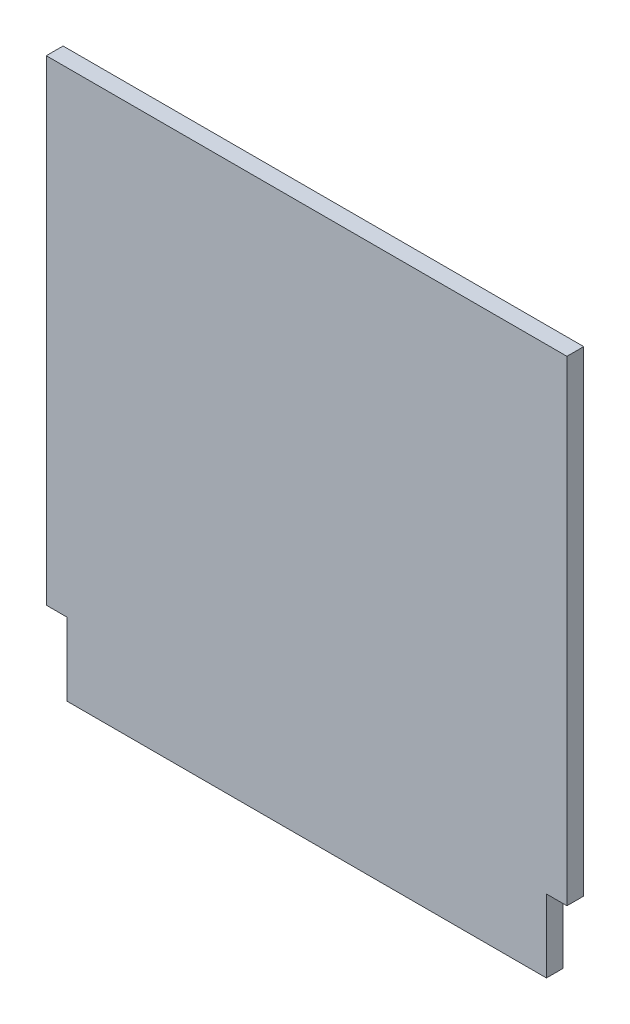
ISO-10303-21;
HEADER;
FILE_DESCRIPTION(('STEP AP214'),'2;1');
FILE_NAME('part.step','',(''),(''),'','','');
FILE_SCHEMA(('AUTOMOTIVE_DESIGN { 1 0 10303 214 1 1 1 1 }'));
ENDSEC;
DATA;
#1=APPLICATION_CONTEXT('core data for automotive mechanical design processes');
#2=APPLICATION_PROTOCOL_DEFINITION('international standard','automotive_design',2000,#1);
#3=PRODUCT_CONTEXT('',#1,'mechanical');
#4=PRODUCT('Part','Part','',(#3));
#5=PRODUCT_RELATED_PRODUCT_CATEGORY('part','',(#4));
#6=PRODUCT_DEFINITION_FORMATION('','',#4);
#7=PRODUCT_DEFINITION_CONTEXT('part definition',#1,'design');
#8=PRODUCT_DEFINITION('design','',#6,#7);
#9=PRODUCT_DEFINITION_SHAPE('','',#8);
#10=(LENGTH_UNIT() NAMED_UNIT(*) SI_UNIT(.MILLI.,.METRE.));
#11=(NAMED_UNIT(*) PLANE_ANGLE_UNIT() SI_UNIT($,.RADIAN.));
#12=(NAMED_UNIT(*) SI_UNIT($,.STERADIAN.) SOLID_ANGLE_UNIT());
#13=UNCERTAINTY_MEASURE_WITH_UNIT(LENGTH_MEASURE(1.E-05),#10,'distance_accuracy_value','');
#14=(GEOMETRIC_REPRESENTATION_CONTEXT(3) GLOBAL_UNCERTAINTY_ASSIGNED_CONTEXT((#13)) GLOBAL_UNIT_ASSIGNED_CONTEXT((#10,
#11,#12)) REPRESENTATION_CONTEXT('',''));
#15=CARTESIAN_POINT('',(0.,0.,0.));
#16=DIRECTION('',(0.,0.,1.));
#17=DIRECTION('',(1.,0.,0.));
#18=AXIS2_PLACEMENT_3D('',#15,#16,#17);
#19=CARTESIAN_POINT('',(46.5,49.,3.));
#20=DIRECTION('',(-1.,0.,0.));
#21=DIRECTION('',(0.,-1.,0.));
#22=AXIS2_PLACEMENT_3D('',#19,#20,#21);
#23=PLANE('',#22);
#24=DIRECTION('',(0.,1.,0.));
#25=VECTOR('',#24,1.);
#26=CARTESIAN_POINT('',(46.5,49.,3.));
#27=LINE('',#26,#25);
#28=CARTESIAN_POINT('',(46.5,-36.,3.));
#29=VERTEX_POINT('',#28);
#30=CARTESIAN_POINT('',(46.5,49.,3.));
#31=VERTEX_POINT('',#30);
#32=EDGE_CURVE('E156',#29,#31,#27,.T.);
#33=ORIENTED_EDGE('',*,*,#32,.F.);
#34=DIRECTION('',(0.,0.,1.));
#35=VECTOR('',#34,1.);
#36=CARTESIAN_POINT('',(46.5,-36.,0.));
#37=LINE('',#36,#35);
#38=CARTESIAN_POINT('',(46.5,-36.,0.));
#39=VERTEX_POINT('',#38);
#40=EDGE_CURVE('E198',#39,#29,#37,.T.);
#41=ORIENTED_EDGE('',*,*,#40,.F.);
#42=DIRECTION('',(0.,1.,0.));
#43=VECTOR('',#42,1.);
#44=CARTESIAN_POINT('',(46.5,49.,0.));
#45=LINE('',#44,#43);
#46=CARTESIAN_POINT('',(46.5,49.,0.));
#47=VERTEX_POINT('',#46);
#48=EDGE_CURVE('E175',#39,#47,#45,.T.);
#49=ORIENTED_EDGE('',*,*,#48,.T.);
#50=DIRECTION('',(0.,0.,-1.));
#51=VECTOR('',#50,1.);
#52=CARTESIAN_POINT('',(46.5,49.,3.));
#53=LINE('',#52,#51);
#54=EDGE_CURVE('E12',#31,#47,#53,.T.);
#55=ORIENTED_EDGE('',*,*,#54,.F.);
#56=EDGE_LOOP('',(#33,#41,#49,#55));
#57=FACE_BOUND('',#56,.T.);
#58=ADVANCED_FACE('F48',(#57),#23,.F.);
#59=CARTESIAN_POINT('',(-46.5,49.,3.));
#60=DIRECTION('',(0.,-1.,0.));
#61=DIRECTION('',(0.,0.,-1.));
#62=AXIS2_PLACEMENT_3D('',#59,#60,#61);
#63=PLANE('',#62);
#64=DIRECTION('',(-1.,0.,0.));
#65=VECTOR('',#64,1.);
#66=CARTESIAN_POINT('',(-46.5,49.,0.));
#67=LINE('',#66,#65);
#68=CARTESIAN_POINT('',(-46.5,49.,0.));
#69=VERTEX_POINT('',#68);
#70=EDGE_CURVE('E166',#47,#69,#67,.T.);
#71=ORIENTED_EDGE('',*,*,#70,.T.);
#72=DIRECTION('',(0.,0.,-1.));
#73=VECTOR('',#72,1.);
#74=CARTESIAN_POINT('',(-46.5,49.,3.));
#75=LINE('',#74,#73);
#76=CARTESIAN_POINT('',(-46.5,49.,3.));
#77=VERTEX_POINT('',#76);
#78=EDGE_CURVE('E58',#77,#69,#75,.T.);
#79=ORIENTED_EDGE('',*,*,#78,.F.);
#80=DIRECTION('',(-1.,0.,0.));
#81=VECTOR('',#80,1.);
#82=CARTESIAN_POINT('',(-46.5,49.,3.));
#83=LINE('',#82,#81);
#84=EDGE_CURVE('E162',#31,#77,#83,.T.);
#85=ORIENTED_EDGE('',*,*,#84,.F.);
#86=ORIENTED_EDGE('',*,*,#54,.T.);
#87=EDGE_LOOP('',(#71,#79,#85,#86));
#88=FACE_BOUND('',#87,.T.);
#89=ADVANCED_FACE('F257',(#88),#63,.F.);
#90=CARTESIAN_POINT('',(-46.5,49.,3.));
#91=DIRECTION('',(1.,0.,0.));
#92=DIRECTION('',(0.,1.,0.));
#93=AXIS2_PLACEMENT_3D('',#90,#91,#92);
#94=PLANE('',#93);
#95=DIRECTION('',(0.,-1.,0.));
#96=VECTOR('',#95,1.);
#97=CARTESIAN_POINT('',(-46.5,49.,0.));
#98=LINE('',#97,#96);
#99=CARTESIAN_POINT('',(-46.5,-36.,0.));
#100=VERTEX_POINT('',#99);
#101=EDGE_CURVE('E157',#69,#100,#98,.T.);
#102=ORIENTED_EDGE('',*,*,#101,.T.);
#103=DIRECTION('',(0.,0.,1.));
#104=VECTOR('',#103,1.);
#105=CARTESIAN_POINT('',(-46.5,-36.,0.));
#106=LINE('',#105,#104);
#107=CARTESIAN_POINT('',(-46.5,-36.,3.));
#108=VERTEX_POINT('',#107);
#109=EDGE_CURVE('E179',#100,#108,#106,.T.);
#110=ORIENTED_EDGE('',*,*,#109,.T.);
#111=DIRECTION('',(0.,-1.,0.));
#112=VECTOR('',#111,1.);
#113=CARTESIAN_POINT('',(-46.5,49.,3.));
#114=LINE('',#113,#112);
#115=EDGE_CURVE('E261',#77,#108,#114,.T.);
#116=ORIENTED_EDGE('',*,*,#115,.F.);
#117=ORIENTED_EDGE('',*,*,#78,.T.);
#118=EDGE_LOOP('',(#102,#110,#116,#117));
#119=FACE_BOUND('',#118,.T.);
#120=ADVANCED_FACE('F275',(#119),#94,.F.);
#121=CARTESIAN_POINT('',(-46.5,-49.,3.));
#122=DIRECTION('',(0.,1.,0.));
#123=DIRECTION('',(0.,0.,1.));
#124=AXIS2_PLACEMENT_3D('',#121,#122,#123);
#125=PLANE('',#124);
#126=DIRECTION('',(1.,0.,0.));
#127=VECTOR('',#126,1.);
#128=CARTESIAN_POINT('',(-46.5,-49.,3.));
#129=LINE('',#128,#127);
#130=CARTESIAN_POINT('',(-42.8416656067142,-49.,3.));
#131=VERTEX_POINT('',#130);
#132=CARTESIAN_POINT('',(42.8416656067142,-49.,3.));
#133=VERTEX_POINT('',#132);
#134=EDGE_CURVE('E149',#131,#133,#129,.T.);
#135=ORIENTED_EDGE('',*,*,#134,.F.);
#136=DIRECTION('',(0.,0.,1.));
#137=VECTOR('',#136,1.);
#138=CARTESIAN_POINT('',(-42.8416656067142,-49.,0.));
#139=LINE('',#138,#137);
#140=CARTESIAN_POINT('',(-42.8416656067142,-49.,0.));
#141=VERTEX_POINT('',#140);
#142=EDGE_CURVE('E135',#141,#131,#139,.T.);
#143=ORIENTED_EDGE('',*,*,#142,.F.);
#144=DIRECTION('',(1.,0.,0.));
#145=VECTOR('',#144,1.);
#146=CARTESIAN_POINT('',(-46.5,-49.,0.));
#147=LINE('',#146,#145);
#148=CARTESIAN_POINT('',(42.8416656067142,-49.,0.));
#149=VERTEX_POINT('',#148);
#150=EDGE_CURVE('E147',#141,#149,#147,.T.);
#151=ORIENTED_EDGE('',*,*,#150,.T.);
#152=DIRECTION('',(0.,0.,1.));
#153=VECTOR('',#152,1.);
#154=CARTESIAN_POINT('',(42.8416656067142,-49.,0.));
#155=LINE('',#154,#153);
#156=EDGE_CURVE('E78',#149,#133,#155,.T.);
#157=ORIENTED_EDGE('',*,*,#156,.T.);
#158=EDGE_LOOP('',(#135,#143,#151,#157));
#159=FACE_BOUND('',#158,.T.);
#160=ADVANCED_FACE('F146',(#159),#125,.F.);
#161=CARTESIAN_POINT('',(0.,0.,3.));
#162=DIRECTION('',(0.,0.,1.));
#163=DIRECTION('',(1.,0.,0.));
#164=AXIS2_PLACEMENT_3D('',#161,#162,#163);
#165=PLANE('',#164);
#166=DIRECTION('',(-1.,0.,0.));
#167=VECTOR('',#166,1.);
#168=CARTESIAN_POINT('',(-46.5,-36.,3.));
#169=LINE('',#168,#167);
#170=CARTESIAN_POINT('',(-42.8416656067142,-36.,3.));
#171=VERTEX_POINT('',#170);
#172=EDGE_CURVE('E141',#171,#108,#169,.T.);
#173=ORIENTED_EDGE('',*,*,#172,.F.);
#174=DIRECTION('',(0.,1.,0.));
#175=VECTOR('',#174,1.);
#176=CARTESIAN_POINT('',(-42.8416656067142,-36.,3.));
#177=LINE('',#176,#175);
#178=EDGE_CURVE('E194',#131,#171,#177,.T.);
#179=ORIENTED_EDGE('',*,*,#178,.F.);
#180=ORIENTED_EDGE('',*,*,#134,.T.);
#181=DIRECTION('',(0.,-1.,0.));
#182=VECTOR('',#181,1.);
#183=CARTESIAN_POINT('',(42.8416656067142,-36.,3.));
#184=LINE('',#183,#182);
#185=CARTESIAN_POINT('',(42.8416656067142,-36.,3.));
#186=VERTEX_POINT('',#185);
#187=EDGE_CURVE('E208',#186,#133,#184,.T.);
#188=ORIENTED_EDGE('',*,*,#187,.F.);
#189=DIRECTION('',(-1.,0.,0.));
#190=VECTOR('',#189,1.);
#191=CARTESIAN_POINT('',(46.5,-36.,3.));
#192=LINE('',#191,#190);
#193=EDGE_CURVE('E213',#29,#186,#192,.T.);
#194=ORIENTED_EDGE('',*,*,#193,.F.);
#195=ORIENTED_EDGE('',*,*,#32,.T.);
#196=ORIENTED_EDGE('',*,*,#84,.T.);
#197=ORIENTED_EDGE('',*,*,#115,.T.);
#198=EDGE_LOOP('',(#173,#179,#180,#188,#194,#195,#196,#197));
#199=FACE_BOUND('',#198,.T.);
#200=ADVANCED_FACE('F252',(#199),#165,.T.);
#201=CARTESIAN_POINT('',(0.,0.,0.));
#202=DIRECTION('',(0.,0.,1.));
#203=DIRECTION('',(1.,0.,0.));
#204=AXIS2_PLACEMENT_3D('',#201,#202,#203);
#205=PLANE('',#204);
#206=DIRECTION('',(0.,1.,0.));
#207=VECTOR('',#206,1.);
#208=CARTESIAN_POINT('',(-42.8416656067142,-36.,0.));
#209=LINE('',#208,#207);
#210=CARTESIAN_POINT('',(-42.8416656067142,-36.,0.));
#211=VERTEX_POINT('',#210);
#212=EDGE_CURVE('E131',#141,#211,#209,.T.);
#213=ORIENTED_EDGE('',*,*,#212,.T.);
#214=DIRECTION('',(-1.,0.,0.));
#215=VECTOR('',#214,1.);
#216=CARTESIAN_POINT('',(-46.5,-36.,0.));
#217=LINE('',#216,#215);
#218=EDGE_CURVE('E68',#211,#100,#217,.T.);
#219=ORIENTED_EDGE('',*,*,#218,.T.);
#220=ORIENTED_EDGE('',*,*,#101,.F.);
#221=ORIENTED_EDGE('',*,*,#70,.F.);
#222=ORIENTED_EDGE('',*,*,#48,.F.);
#223=DIRECTION('',(-1.,0.,0.));
#224=VECTOR('',#223,1.);
#225=CARTESIAN_POINT('',(46.5,-36.,0.));
#226=LINE('',#225,#224);
#227=CARTESIAN_POINT('',(42.8416656067142,-36.,0.));
#228=VERTEX_POINT('',#227);
#229=EDGE_CURVE('E212',#39,#228,#226,.T.);
#230=ORIENTED_EDGE('',*,*,#229,.T.);
#231=DIRECTION('',(0.,-1.,0.));
#232=VECTOR('',#231,1.);
#233=CARTESIAN_POINT('',(42.8416656067142,-36.,0.));
#234=LINE('',#233,#232);
#235=EDGE_CURVE('E154',#228,#149,#234,.T.);
#236=ORIENTED_EDGE('',*,*,#235,.T.);
#237=ORIENTED_EDGE('',*,*,#150,.F.);
#238=EDGE_LOOP('',(#213,#219,#220,#221,#222,#230,#236,#237));
#239=FACE_BOUND('',#238,.T.);
#240=ADVANCED_FACE('F152',(#239),#205,.F.);
#241=CARTESIAN_POINT('',(46.5,-36.,0.));
#242=DIRECTION('',(0.,1.,0.));
#243=DIRECTION('',(0.,0.,1.));
#244=AXIS2_PLACEMENT_3D('',#241,#242,#243);
#245=PLANE('',#244);
#246=ORIENTED_EDGE('',*,*,#193,.T.);
#247=DIRECTION('',(0.,0.,1.));
#248=VECTOR('',#247,1.);
#249=CARTESIAN_POINT('',(42.8416656067142,-36.,0.));
#250=LINE('',#249,#248);
#251=EDGE_CURVE('E236',#228,#186,#250,.T.);
#252=ORIENTED_EDGE('',*,*,#251,.F.);
#253=ORIENTED_EDGE('',*,*,#229,.F.);
#254=ORIENTED_EDGE('',*,*,#40,.T.);
#255=EDGE_LOOP('',(#246,#252,#253,#254));
#256=FACE_BOUND('',#255,.T.);
#257=ADVANCED_FACE('F244',(#256),#245,.F.);
#258=CARTESIAN_POINT('',(42.8416656067142,-36.,0.));
#259=DIRECTION('',(-1.,0.,0.));
#260=DIRECTION('',(0.,0.,1.));
#261=AXIS2_PLACEMENT_3D('',#258,#259,#260);
#262=PLANE('',#261);
#263=ORIENTED_EDGE('',*,*,#187,.T.);
#264=ORIENTED_EDGE('',*,*,#156,.F.);
#265=ORIENTED_EDGE('',*,*,#235,.F.);
#266=ORIENTED_EDGE('',*,*,#251,.T.);
#267=EDGE_LOOP('',(#263,#264,#265,#266));
#268=FACE_BOUND('',#267,.T.);
#269=ADVANCED_FACE('F281',(#268),#262,.F.);
#270=CARTESIAN_POINT('',(-46.5,-36.,0.));
#271=DIRECTION('',(0.,1.,0.));
#272=DIRECTION('',(0.,0.,1.));
#273=AXIS2_PLACEMENT_3D('',#270,#271,#272);
#274=PLANE('',#273);
#275=ORIENTED_EDGE('',*,*,#172,.T.);
#276=ORIENTED_EDGE('',*,*,#109,.F.);
#277=ORIENTED_EDGE('',*,*,#218,.F.);
#278=DIRECTION('',(0.,0.,1.));
#279=VECTOR('',#278,1.);
#280=CARTESIAN_POINT('',(-42.8416656067142,-36.,0.));
#281=LINE('',#280,#279);
#282=EDGE_CURVE('E137',#211,#171,#281,.T.);
#283=ORIENTED_EDGE('',*,*,#282,.T.);
#284=EDGE_LOOP('',(#275,#276,#277,#283));
#285=FACE_BOUND('',#284,.T.);
#286=ADVANCED_FACE('F278',(#285),#274,.F.);
#287=CARTESIAN_POINT('',(-42.8416656067142,-36.,0.));
#288=DIRECTION('',(1.,0.,0.));
#289=DIRECTION('',(0.,0.,-1.));
#290=AXIS2_PLACEMENT_3D('',#287,#288,#289);
#291=PLANE('',#290);
#292=ORIENTED_EDGE('',*,*,#178,.T.);
#293=ORIENTED_EDGE('',*,*,#282,.F.);
#294=ORIENTED_EDGE('',*,*,#212,.F.);
#295=ORIENTED_EDGE('',*,*,#142,.T.);
#296=EDGE_LOOP('',(#292,#293,#294,#295));
#297=FACE_BOUND('',#296,.T.);
#298=ADVANCED_FACE('F134',(#297),#291,.F.);
#299=CLOSED_SHELL('',(#58,#89,#120,#160,#200,#240,#257,#269,#286,#298));
#300=MANIFOLD_SOLID_BREP('B2',#299);
#301=ADVANCED_BREP_SHAPE_REPRESENTATION('',(#18,#300),#14);
#302=SHAPE_DEFINITION_REPRESENTATION(#9,#301);
ENDSEC;
END-ISO-10303-21;
